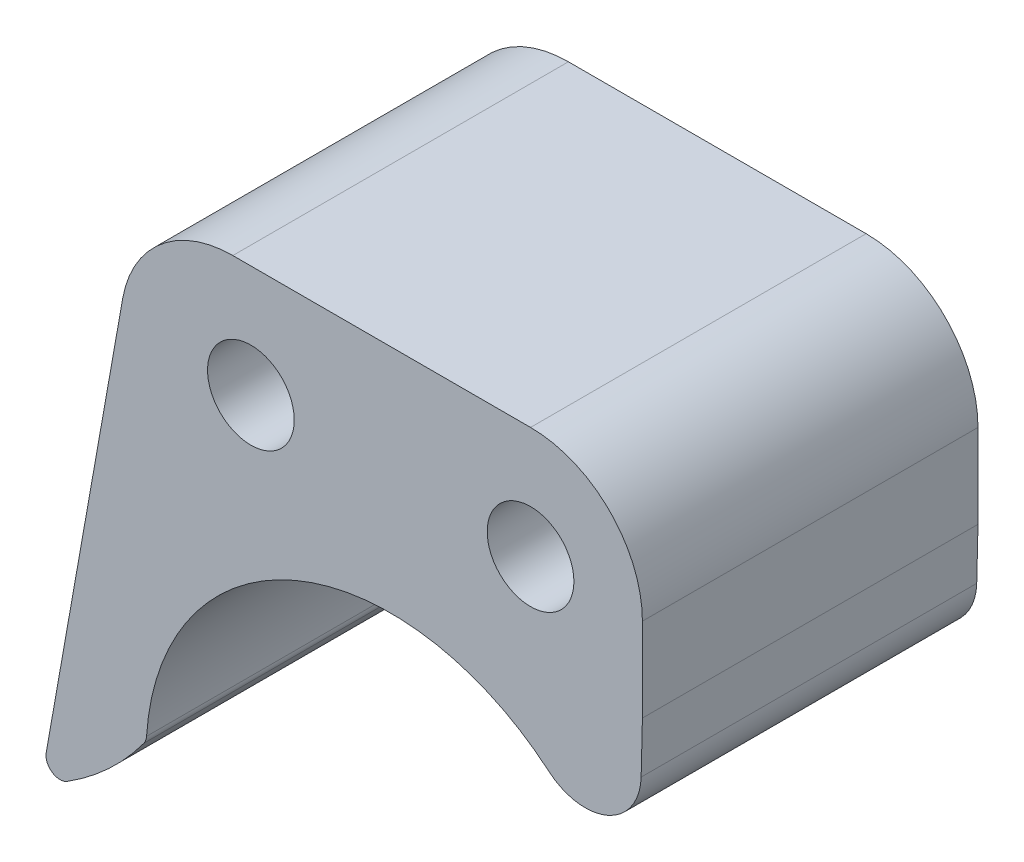
ISO-10303-21;
HEADER;
FILE_DESCRIPTION(('STEP AP214'),'2;1');
FILE_NAME('part.step','',(''),(''),'','','');
FILE_SCHEMA(('AUTOMOTIVE_DESIGN { 1 0 10303 214 1 1 1 1 }'));
ENDSEC;
DATA;
#1=APPLICATION_CONTEXT('core data for automotive mechanical design processes');
#2=APPLICATION_PROTOCOL_DEFINITION('international standard','automotive_design',2000,#1);
#3=PRODUCT_CONTEXT('',#1,'mechanical');
#4=PRODUCT('Part','Part','',(#3));
#5=PRODUCT_RELATED_PRODUCT_CATEGORY('part','',(#4));
#6=PRODUCT_DEFINITION_FORMATION('','',#4);
#7=PRODUCT_DEFINITION_CONTEXT('part definition',#1,'design');
#8=PRODUCT_DEFINITION('design','',#6,#7);
#9=PRODUCT_DEFINITION_SHAPE('','',#8);
#10=(LENGTH_UNIT() NAMED_UNIT(*) SI_UNIT(.MILLI.,.METRE.));
#11=(NAMED_UNIT(*) PLANE_ANGLE_UNIT() SI_UNIT($,.RADIAN.));
#12=(NAMED_UNIT(*) SI_UNIT($,.STERADIAN.) SOLID_ANGLE_UNIT());
#13=UNCERTAINTY_MEASURE_WITH_UNIT(LENGTH_MEASURE(1.E-05),#10,'distance_accuracy_value','');
#14=(GEOMETRIC_REPRESENTATION_CONTEXT(3) GLOBAL_UNCERTAINTY_ASSIGNED_CONTEXT((#13)) GLOBAL_UNIT_ASSIGNED_CONTEXT((#10,
#11,#12)) REPRESENTATION_CONTEXT('',''));
#15=CARTESIAN_POINT('',(0.,0.,0.));
#16=DIRECTION('',(0.,0.,1.));
#17=DIRECTION('',(1.,0.,0.));
#18=AXIS2_PLACEMENT_3D('',#15,#16,#17);
#19=CARTESIAN_POINT('',(0.,0.,12.));
#20=DIRECTION('',(0.,0.,1.));
#21=DIRECTION('',(1.,0.,0.));
#22=AXIS2_PLACEMENT_3D('',#19,#20,#21);
#23=PLANE('',#22);
#24=CARTESIAN_POINT('',(0.,0.,12.));
#25=DIRECTION('',(0.,0.,1.));
#26=DIRECTION('',(1.,0.,0.));
#27=AXIS2_PLACEMENT_3D('',#24,#25,#26);
#28=CIRCLE('',#27,1.55);
#29=CARTESIAN_POINT('',(1.55,0.,12.));
#30=VERTEX_POINT('',#29);
#31=EDGE_CURVE('E207',#30,#30,#28,.T.);
#32=ORIENTED_EDGE('',*,*,#31,.F.);
#33=EDGE_LOOP('',(#32));
#34=FACE_BOUND('',#33,.T.);
#35=CARTESIAN_POINT('',(4.99999999998341,-13.0000000000022,12.));
#36=DIRECTION('',(0.,0.,-1.));
#37=DIRECTION('',(1.,0.,0.));
#38=AXIS2_PLACEMENT_3D('',#35,#36,#37);
#39=CIRCLE('',#38,8.75);
#40=CARTESIAN_POINT('',(-3.73152195715241,-12.4316477218726,12.));
#41=VERTEX_POINT('',#40);
#42=CARTESIAN_POINT('',(10.660883346936,-6.32790139969702,12.));
#43=VERTEX_POINT('',#42);
#44=EDGE_CURVE('E122',#41,#43,#39,.T.);
#45=ORIENTED_EDGE('',*,*,#44,.T.);
#46=CARTESIAN_POINT('',(11.9547995405252,-4.80285029105583,12.));
#47=DIRECTION('',(0.,0.,1.));
#48=DIRECTION('',(1.,0.,0.));
#49=AXIS2_PLACEMENT_3D('',#46,#47,#48);
#50=CIRCLE('',#49,2.);
#51=CARTESIAN_POINT('',(13.9541881281477,-4.85230001991943,12.));
#52=VERTEX_POINT('',#51);
#53=EDGE_CURVE('E57',#43,#52,#50,.T.);
#54=ORIENTED_EDGE('',*,*,#53,.T.);
#55=DIRECTION('',(0.0247248644318036,0.999694293811278,0.));
#56=VECTOR('',#55,1.);
#57=CARTESIAN_POINT('',(14.,-3.,12.));
#58=LINE('',#57,#56);
#59=CARTESIAN_POINT('',(14.,-3.,12.));
#60=VERTEX_POINT('',#59);
#61=EDGE_CURVE('E115',#52,#60,#58,.T.);
#62=ORIENTED_EDGE('',*,*,#61,.T.);
#63=DIRECTION('',(0.,1.,0.));
#64=VECTOR('',#63,1.);
#65=CARTESIAN_POINT('',(14.,-3.,12.));
#66=LINE('',#65,#64);
#67=CARTESIAN_POINT('',(14.,0.,12.));
#68=VERTEX_POINT('',#67);
#69=EDGE_CURVE('E118',#60,#68,#66,.T.);
#70=ORIENTED_EDGE('',*,*,#69,.T.);
#71=CARTESIAN_POINT('',(10.,0.,12.));
#72=DIRECTION('',(0.,0.,1.));
#73=DIRECTION('',(1.,0.,0.));
#74=AXIS2_PLACEMENT_3D('',#71,#72,#73);
#75=CIRCLE('',#74,4.);
#76=CARTESIAN_POINT('',(10.,4.,12.));
#77=VERTEX_POINT('',#76);
#78=EDGE_CURVE('E173',#68,#77,#75,.T.);
#79=ORIENTED_EDGE('',*,*,#78,.T.);
#80=DIRECTION('',(-1.,0.,0.));
#81=VECTOR('',#80,1.);
#82=CARTESIAN_POINT('',(14.,4.,12.));
#83=LINE('',#82,#81);
#84=CARTESIAN_POINT('',(-0.646610090377423,4.,12.));
#85=VERTEX_POINT('',#84);
#86=EDGE_CURVE('E131',#77,#85,#83,.T.);
#87=ORIENTED_EDGE('',*,*,#86,.T.);
#88=CARTESIAN_POINT('',(-0.646610090377422,0.,12.));
#89=DIRECTION('',(0.,0.,1.));
#90=DIRECTION('',(1.,0.,0.));
#91=AXIS2_PLACEMENT_3D('',#88,#89,#90);
#92=CIRCLE('',#91,4.);
#93=CARTESIAN_POINT('',(-4.58522617799293,0.69807113847825,12.));
#94=VERTEX_POINT('',#93);
#95=EDGE_CURVE('E171',#85,#94,#92,.T.);
#96=ORIENTED_EDGE('',*,*,#95,.T.);
#97=DIRECTION('',(-0.174517784619562,-0.984654021903877,0.));
#98=VECTOR('',#97,1.);
#99=CARTESIAN_POINT('',(-4.,4.,12.));
#100=LINE('',#99,#98);
#101=CARTESIAN_POINT('',(-7.32009985962314,-14.7324729512637,12.));
#102=VERTEX_POINT('',#101);
#103=EDGE_CURVE('E192',#94,#102,#100,.T.);
#104=ORIENTED_EDGE('',*,*,#103,.T.);
#105=CARTESIAN_POINT('',(-6.8277728486712,-14.8197318435735,12.));
#106=DIRECTION('',(0.,0.,1.));
#107=DIRECTION('',(1.,0.,0.));
#108=AXIS2_PLACEMENT_3D('',#105,#106,#107);
#109=CIRCLE('',#108,0.5);
#110=CARTESIAN_POINT('',(-6.56123864332342,-15.2427679145883,12.));
#111=VERTEX_POINT('',#110);
#112=EDGE_CURVE('E147',#102,#111,#109,.T.);
#113=ORIENTED_EDGE('',*,*,#112,.T.);
#114=CARTESIAN_POINT('',(-11.891922750279,-6.78204649429253,12.));
#115=DIRECTION('',(0.,0.,1.));
#116=DIRECTION('',(1.,0.,0.));
#117=AXIS2_PLACEMENT_3D('',#114,#115,#116);
#118=CIRCLE('',#117,10.);
#119=CARTESIAN_POINT('',(-3.82723150681556,-12.6948085517073,12.));
#120=VERTEX_POINT('',#119);
#121=EDGE_CURVE('E190',#111,#120,#118,.T.);
#122=ORIENTED_EDGE('',*,*,#121,.T.);
#123=CARTESIAN_POINT('',(-4.23046606898874,-12.3991704488366,12.));
#124=DIRECTION('',(0.,0.,1.));
#125=DIRECTION('',(1.,0.,0.));
#126=AXIS2_PLACEMENT_3D('',#123,#124,#125);
#127=CIRCLE('',#126,0.5);
#128=EDGE_CURVE('E149',#120,#41,#127,.T.);
#129=ORIENTED_EDGE('',*,*,#128,.T.);
#130=EDGE_LOOP('',(#45,#54,#62,#70,#79,#87,#96,#104,#113,#122,#129));
#131=FACE_BOUND('',#130,.T.);
#132=CARTESIAN_POINT('',(10.,0.,12.));
#133=DIRECTION('',(0.,0.,1.));
#134=DIRECTION('',(1.,0.,0.));
#135=AXIS2_PLACEMENT_3D('',#132,#133,#134);
#136=CIRCLE('',#135,1.55);
#137=CARTESIAN_POINT('',(11.55,0.,12.));
#138=VERTEX_POINT('',#137);
#139=EDGE_CURVE('E201',#138,#138,#136,.T.);
#140=ORIENTED_EDGE('',*,*,#139,.F.);
#141=EDGE_LOOP('',(#140));
#142=FACE_BOUND('',#141,.T.);
#143=ADVANCED_FACE('F35',(#34,#131,#142),#23,.T.);
#144=CARTESIAN_POINT('',(0.,0.,0.));
#145=DIRECTION('',(0.,0.,1.));
#146=DIRECTION('',(1.,0.,0.));
#147=AXIS2_PLACEMENT_3D('',#144,#145,#146);
#148=PLANE('',#147);
#149=DIRECTION('',(-0.0247248644318036,-0.999694293811278,0.));
#150=VECTOR('',#149,1.);
#151=CARTESIAN_POINT('',(14.,-3.,0.));
#152=LINE('',#151,#150);
#153=CARTESIAN_POINT('',(14.,-3.,0.));
#154=VERTEX_POINT('',#153);
#155=CARTESIAN_POINT('',(13.9541881281477,-4.85230001991943,0.));
#156=VERTEX_POINT('',#155);
#157=EDGE_CURVE('E135',#154,#156,#152,.T.);
#158=ORIENTED_EDGE('',*,*,#157,.T.);
#159=CARTESIAN_POINT('',(11.9547995405252,-4.80285029105583,0.));
#160=DIRECTION('',(0.,0.,1.));
#161=DIRECTION('',(1.,0.,0.));
#162=AXIS2_PLACEMENT_3D('',#159,#160,#161);
#163=CIRCLE('',#162,2.);
#164=CARTESIAN_POINT('',(10.660883346936,-6.32790139969702,0.));
#165=VERTEX_POINT('',#164);
#166=EDGE_CURVE('E11',#156,#165,#163,.F.);
#167=ORIENTED_EDGE('',*,*,#166,.T.);
#168=CARTESIAN_POINT('',(4.99999999998341,-13.0000000000022,0.));
#169=DIRECTION('',(0.,0.,1.));
#170=DIRECTION('',(1.,0.,0.));
#171=AXIS2_PLACEMENT_3D('',#168,#169,#170);
#172=CIRCLE('',#171,8.75);
#173=CARTESIAN_POINT('',(-3.73152195715241,-12.4316477218726,0.));
#174=VERTEX_POINT('',#173);
#175=EDGE_CURVE('E121',#165,#174,#172,.T.);
#176=ORIENTED_EDGE('',*,*,#175,.T.);
#177=CARTESIAN_POINT('',(-4.23046606898874,-12.3991704488366,0.));
#178=DIRECTION('',(0.,0.,1.));
#179=DIRECTION('',(1.,0.,0.));
#180=AXIS2_PLACEMENT_3D('',#177,#178,#179);
#181=CIRCLE('',#180,0.5);
#182=CARTESIAN_POINT('',(-3.82723150681556,-12.6948085517073,0.));
#183=VERTEX_POINT('',#182);
#184=EDGE_CURVE('E156',#174,#183,#181,.F.);
#185=ORIENTED_EDGE('',*,*,#184,.T.);
#186=CARTESIAN_POINT('',(-11.891922750279,-6.78204649429253,0.));
#187=DIRECTION('',(0.,0.,1.));
#188=DIRECTION('',(1.,0.,0.));
#189=AXIS2_PLACEMENT_3D('',#186,#187,#188);
#190=CIRCLE('',#189,10.);
#191=CARTESIAN_POINT('',(-6.56123864332342,-15.2427679145883,0.));
#192=VERTEX_POINT('',#191);
#193=EDGE_CURVE('E196',#183,#192,#190,.F.);
#194=ORIENTED_EDGE('',*,*,#193,.T.);
#195=CARTESIAN_POINT('',(-6.8277728486712,-14.8197318435735,0.));
#196=DIRECTION('',(0.,0.,1.));
#197=DIRECTION('',(1.,0.,0.));
#198=AXIS2_PLACEMENT_3D('',#195,#196,#197);
#199=CIRCLE('',#198,0.5);
#200=CARTESIAN_POINT('',(-7.32009985962314,-14.7324729512637,0.));
#201=VERTEX_POINT('',#200);
#202=EDGE_CURVE('E154',#192,#201,#199,.F.);
#203=ORIENTED_EDGE('',*,*,#202,.T.);
#204=DIRECTION('',(0.174517784619562,0.984654021903877,0.));
#205=VECTOR('',#204,1.);
#206=CARTESIAN_POINT('',(-4.,4.,0.));
#207=LINE('',#206,#205);
#208=CARTESIAN_POINT('',(-4.58522617799293,0.698071138478249,0.));
#209=VERTEX_POINT('',#208);
#210=EDGE_CURVE('E200',#201,#209,#207,.T.);
#211=ORIENTED_EDGE('',*,*,#210,.T.);
#212=CARTESIAN_POINT('',(-0.646610090377422,0.,0.));
#213=DIRECTION('',(0.,0.,1.));
#214=DIRECTION('',(1.,0.,0.));
#215=AXIS2_PLACEMENT_3D('',#212,#213,#214);
#216=CIRCLE('',#215,4.);
#217=CARTESIAN_POINT('',(-0.646610090377423,4.,0.));
#218=VERTEX_POINT('',#217);
#219=EDGE_CURVE('E166',#209,#218,#216,.F.);
#220=ORIENTED_EDGE('',*,*,#219,.T.);
#221=DIRECTION('',(-1.,0.,0.));
#222=VECTOR('',#221,1.);
#223=CARTESIAN_POINT('',(14.,4.,0.));
#224=LINE('',#223,#222);
#225=CARTESIAN_POINT('',(10.,4.,0.));
#226=VERTEX_POINT('',#225);
#227=EDGE_CURVE('E132',#226,#218,#224,.T.);
#228=ORIENTED_EDGE('',*,*,#227,.F.);
#229=CARTESIAN_POINT('',(10.,0.,0.));
#230=DIRECTION('',(0.,0.,1.));
#231=DIRECTION('',(1.,0.,0.));
#232=AXIS2_PLACEMENT_3D('',#229,#230,#231);
#233=CIRCLE('',#232,4.);
#234=CARTESIAN_POINT('',(14.,0.,0.));
#235=VERTEX_POINT('',#234);
#236=EDGE_CURVE('E168',#226,#235,#233,.F.);
#237=ORIENTED_EDGE('',*,*,#236,.T.);
#238=DIRECTION('',(0.,1.,0.));
#239=VECTOR('',#238,1.);
#240=CARTESIAN_POINT('',(14.,-3.,0.));
#241=LINE('',#240,#239);
#242=EDGE_CURVE('E210',#154,#235,#241,.T.);
#243=ORIENTED_EDGE('',*,*,#242,.F.);
#244=EDGE_LOOP('',(#158,#167,#176,#185,#194,#203,#211,#220,#228,#237,#243));
#245=FACE_BOUND('',#244,.T.);
#246=CARTESIAN_POINT('',(0.,0.,0.));
#247=DIRECTION('',(0.,0.,1.));
#248=DIRECTION('',(1.,0.,0.));
#249=AXIS2_PLACEMENT_3D('',#246,#247,#248);
#250=CIRCLE('',#249,1.55);
#251=CARTESIAN_POINT('',(1.55,0.,0.));
#252=VERTEX_POINT('',#251);
#253=EDGE_CURVE('E204',#252,#252,#250,.T.);
#254=ORIENTED_EDGE('',*,*,#253,.T.);
#255=EDGE_LOOP('',(#254));
#256=FACE_BOUND('',#255,.T.);
#257=CARTESIAN_POINT('',(10.,0.,0.));
#258=DIRECTION('',(0.,0.,1.));
#259=DIRECTION('',(1.,0.,0.));
#260=AXIS2_PLACEMENT_3D('',#257,#258,#259);
#261=CIRCLE('',#260,1.55);
#262=CARTESIAN_POINT('',(11.55,0.,0.));
#263=VERTEX_POINT('',#262);
#264=EDGE_CURVE('E199',#263,#263,#261,.T.);
#265=ORIENTED_EDGE('',*,*,#264,.T.);
#266=EDGE_LOOP('',(#265));
#267=FACE_BOUND('',#266,.T.);
#268=ADVANCED_FACE('F234',(#245,#256,#267),#148,.F.);
#269=CARTESIAN_POINT('',(14.,-3.,12.));
#270=DIRECTION('',(-1.,0.,0.));
#271=DIRECTION('',(0.,0.,1.));
#272=AXIS2_PLACEMENT_3D('',#269,#270,#271);
#273=PLANE('',#272);
#274=ORIENTED_EDGE('',*,*,#242,.T.);
#275=DIRECTION('',(0.,0.,-1.));
#276=VECTOR('',#275,1.);
#277=CARTESIAN_POINT('',(14.,0.,12.));
#278=LINE('',#277,#276);
#279=EDGE_CURVE('E130',#235,#68,#278,.F.);
#280=ORIENTED_EDGE('',*,*,#279,.T.);
#281=ORIENTED_EDGE('',*,*,#69,.F.);
#282=DIRECTION('',(0.,0.,-1.));
#283=VECTOR('',#282,1.);
#284=CARTESIAN_POINT('',(14.,-3.,12.));
#285=LINE('',#284,#283);
#286=EDGE_CURVE('E127',#60,#154,#285,.T.);
#287=ORIENTED_EDGE('',*,*,#286,.T.);
#288=EDGE_LOOP('',(#274,#280,#281,#287));
#289=FACE_BOUND('',#288,.T.);
#290=ADVANCED_FACE('F126',(#289),#273,.F.);
#291=CARTESIAN_POINT('',(14.,4.,12.));
#292=DIRECTION('',(0.,-1.,0.));
#293=DIRECTION('',(1.,0.,0.));
#294=AXIS2_PLACEMENT_3D('',#291,#292,#293);
#295=PLANE('',#294);
#296=ORIENTED_EDGE('',*,*,#86,.F.);
#297=DIRECTION('',(0.,0.,-1.));
#298=VECTOR('',#297,1.);
#299=CARTESIAN_POINT('',(10.,4.,12.));
#300=LINE('',#299,#298);
#301=EDGE_CURVE('E163',#77,#226,#300,.T.);
#302=ORIENTED_EDGE('',*,*,#301,.T.);
#303=ORIENTED_EDGE('',*,*,#227,.T.);
#304=DIRECTION('',(0.,0.,-1.));
#305=VECTOR('',#304,1.);
#306=CARTESIAN_POINT('',(-0.646610090377423,4.,12.));
#307=LINE('',#306,#305);
#308=EDGE_CURVE('E161',#218,#85,#307,.F.);
#309=ORIENTED_EDGE('',*,*,#308,.T.);
#310=EDGE_LOOP('',(#296,#302,#303,#309));
#311=FACE_BOUND('',#310,.T.);
#312=ADVANCED_FACE('F217',(#311),#295,.F.);
#313=CARTESIAN_POINT('',(0.,0.,12.));
#314=DIRECTION('',(0.,0.,-1.));
#315=DIRECTION('',(-1.,0.,0.));
#316=AXIS2_PLACEMENT_3D('',#313,#314,#315);
#317=CYLINDRICAL_SURFACE('',#316,1.55);
#318=ORIENTED_EDGE('',*,*,#31,.T.);
#319=EDGE_LOOP('',(#318));
#320=FACE_BOUND('',#319,.T.);
#321=ORIENTED_EDGE('',*,*,#253,.F.);
#322=EDGE_LOOP('',(#321));
#323=FACE_BOUND('',#322,.T.);
#324=ADVANCED_FACE('F267',(#320,#323),#317,.F.);
#325=CARTESIAN_POINT('',(10.,0.,12.));
#326=DIRECTION('',(0.,0.,-1.));
#327=DIRECTION('',(-1.,0.,0.));
#328=AXIS2_PLACEMENT_3D('',#325,#326,#327);
#329=CYLINDRICAL_SURFACE('',#328,1.55);
#330=ORIENTED_EDGE('',*,*,#139,.T.);
#331=EDGE_LOOP('',(#330));
#332=FACE_BOUND('',#331,.T.);
#333=ORIENTED_EDGE('',*,*,#264,.F.);
#334=EDGE_LOOP('',(#333));
#335=FACE_BOUND('',#334,.T.);
#336=ADVANCED_FACE('F288',(#332,#335),#329,.F.);
#337=CARTESIAN_POINT('',(-4.,4.,-29.2090288510913));
#338=DIRECTION('',(-0.984654021903877,0.174517784619562,0.));
#339=DIRECTION('',(-0.174517784619562,-0.984654021903877,0.));
#340=AXIS2_PLACEMENT_3D('',#337,#338,#339);
#341=PLANE('',#340);
#342=ORIENTED_EDGE('',*,*,#103,.F.);
#343=DIRECTION('',(0.,0.,-1.));
#344=VECTOR('',#343,1.);
#345=CARTESIAN_POINT('',(-4.58522617799293,0.69807113847825,0.));
#346=LINE('',#345,#344);
#347=EDGE_CURVE('E175',#94,#209,#346,.T.);
#348=ORIENTED_EDGE('',*,*,#347,.T.);
#349=ORIENTED_EDGE('',*,*,#210,.F.);
#350=DIRECTION('',(0.,0.,1.));
#351=VECTOR('',#350,1.);
#352=CARTESIAN_POINT('',(-7.32009985962314,-14.7324729512637,-29.2090288510913));
#353=LINE('',#352,#351);
#354=EDGE_CURVE('E158',#201,#102,#353,.T.);
#355=ORIENTED_EDGE('',*,*,#354,.T.);
#356=EDGE_LOOP('',(#342,#348,#349,#355));
#357=FACE_BOUND('',#356,.T.);
#358=ADVANCED_FACE('F227',(#357),#341,.T.);
#359=CARTESIAN_POINT('',(14.,-3.,-29.2090288510913));
#360=DIRECTION('',(0.999694293811278,-0.0247248644318036,0.));
#361=DIRECTION('',(0.0247248644318036,0.999694293811278,0.));
#362=AXIS2_PLACEMENT_3D('',#359,#360,#361);
#363=PLANE('',#362);
#364=ORIENTED_EDGE('',*,*,#61,.F.);
#365=DIRECTION('',(0.,0.,1.));
#366=VECTOR('',#365,1.);
#367=CARTESIAN_POINT('',(13.9541881281477,-4.85230001991943,-29.2090288510913));
#368=LINE('',#367,#366);
#369=EDGE_CURVE('E43',#52,#156,#368,.F.);
#370=ORIENTED_EDGE('',*,*,#369,.T.);
#371=ORIENTED_EDGE('',*,*,#157,.F.);
#372=ORIENTED_EDGE('',*,*,#286,.F.);
#373=EDGE_LOOP('',(#364,#370,#371,#372));
#374=FACE_BOUND('',#373,.T.);
#375=ADVANCED_FACE('F134',(#374),#363,.T.);
#376=CARTESIAN_POINT('',(4.99999999998341,-13.0000000000022,-29.2090288510913));
#377=DIRECTION('',(0.,0.,1.));
#378=DIRECTION('',(1.,0.,0.));
#379=AXIS2_PLACEMENT_3D('',#376,#377,#378);
#380=CYLINDRICAL_SURFACE('',#379,8.75);
#381=ORIENTED_EDGE('',*,*,#175,.F.);
#382=DIRECTION('',(0.,0.,1.));
#383=VECTOR('',#382,1.);
#384=CARTESIAN_POINT('',(10.660883346936,-6.32790139969702,-29.2090288510913));
#385=LINE('',#384,#383);
#386=EDGE_CURVE('E178',#165,#43,#385,.T.);
#387=ORIENTED_EDGE('',*,*,#386,.T.);
#388=ORIENTED_EDGE('',*,*,#44,.F.);
#389=DIRECTION('',(0.,0.,1.));
#390=VECTOR('',#389,1.);
#391=CARTESIAN_POINT('',(-3.7315219571524,-12.4316477218726,-29.2090288510913));
#392=LINE('',#391,#390);
#393=EDGE_CURVE('E151',#41,#174,#392,.F.);
#394=ORIENTED_EDGE('',*,*,#393,.T.);
#395=EDGE_LOOP('',(#381,#387,#388,#394));
#396=FACE_BOUND('',#395,.T.);
#397=ADVANCED_FACE('F185',(#396),#380,.F.);
#398=CARTESIAN_POINT('',(-11.891922750279,-6.78204649429253,-29.2090288510913));
#399=DIRECTION('',(0.,0.,1.));
#400=DIRECTION('',(1.,0.,0.));
#401=AXIS2_PLACEMENT_3D('',#398,#399,#400);
#402=CYLINDRICAL_SURFACE('',#401,10.);
#403=ORIENTED_EDGE('',*,*,#193,.F.);
#404=DIRECTION('',(0.,0.,1.));
#405=VECTOR('',#404,1.);
#406=CARTESIAN_POINT('',(-3.82723150681556,-12.6948085517073,-29.2090288510913));
#407=LINE('',#406,#405);
#408=EDGE_CURVE('E138',#183,#120,#407,.T.);
#409=ORIENTED_EDGE('',*,*,#408,.T.);
#410=ORIENTED_EDGE('',*,*,#121,.F.);
#411=DIRECTION('',(0.,0.,1.));
#412=VECTOR('',#411,1.);
#413=CARTESIAN_POINT('',(-6.56123864332342,-15.2427679145883,-29.2090288510913));
#414=LINE('',#413,#412);
#415=EDGE_CURVE('E136',#111,#192,#414,.F.);
#416=ORIENTED_EDGE('',*,*,#415,.T.);
#417=EDGE_LOOP('',(#403,#409,#410,#416));
#418=FACE_BOUND('',#417,.T.);
#419=ADVANCED_FACE('F243',(#418),#402,.T.);
#420=CARTESIAN_POINT('',(-4.23046606898874,-12.3991704488366,-29.2090288510913));
#421=DIRECTION('',(0.,0.,-1.));
#422=DIRECTION('',(-1.,0.,0.));
#423=AXIS2_PLACEMENT_3D('',#420,#421,#422);
#424=CYLINDRICAL_SURFACE('',#423,0.5);
#425=ORIENTED_EDGE('',*,*,#184,.F.);
#426=ORIENTED_EDGE('',*,*,#393,.F.);
#427=ORIENTED_EDGE('',*,*,#128,.F.);
#428=ORIENTED_EDGE('',*,*,#408,.F.);
#429=EDGE_LOOP('',(#425,#426,#427,#428));
#430=FACE_BOUND('',#429,.T.);
#431=ADVANCED_FACE('F240',(#430),#424,.T.);
#432=CARTESIAN_POINT('',(-6.8277728486712,-14.8197318435735,-29.2090288510913));
#433=DIRECTION('',(0.,0.,1.));
#434=DIRECTION('',(1.,0.,0.));
#435=AXIS2_PLACEMENT_3D('',#432,#433,#434);
#436=CYLINDRICAL_SURFACE('',#435,0.5);
#437=ORIENTED_EDGE('',*,*,#202,.F.);
#438=ORIENTED_EDGE('',*,*,#415,.F.);
#439=ORIENTED_EDGE('',*,*,#112,.F.);
#440=ORIENTED_EDGE('',*,*,#354,.F.);
#441=EDGE_LOOP('',(#437,#438,#439,#440));
#442=FACE_BOUND('',#441,.T.);
#443=ADVANCED_FACE('F247',(#442),#436,.T.);
#444=CARTESIAN_POINT('',(10.,0.,12.));
#445=DIRECTION('',(0.,0.,-1.));
#446=DIRECTION('',(-1.,0.,0.));
#447=AXIS2_PLACEMENT_3D('',#444,#445,#446);
#448=CYLINDRICAL_SURFACE('',#447,4.);
#449=ORIENTED_EDGE('',*,*,#78,.F.);
#450=ORIENTED_EDGE('',*,*,#279,.F.);
#451=ORIENTED_EDGE('',*,*,#236,.F.);
#452=ORIENTED_EDGE('',*,*,#301,.F.);
#453=EDGE_LOOP('',(#449,#450,#451,#452));
#454=FACE_BOUND('',#453,.T.);
#455=ADVANCED_FACE('F249',(#454),#448,.T.);
#456=CARTESIAN_POINT('',(-0.646610090377422,0.,-29.2090288510913));
#457=DIRECTION('',(0.,0.,1.));
#458=DIRECTION('',(1.,0.,0.));
#459=AXIS2_PLACEMENT_3D('',#456,#457,#458);
#460=CYLINDRICAL_SURFACE('',#459,4.);
#461=ORIENTED_EDGE('',*,*,#95,.F.);
#462=ORIENTED_EDGE('',*,*,#308,.F.);
#463=ORIENTED_EDGE('',*,*,#219,.F.);
#464=ORIENTED_EDGE('',*,*,#347,.F.);
#465=EDGE_LOOP('',(#461,#462,#463,#464));
#466=FACE_BOUND('',#465,.T.);
#467=ADVANCED_FACE('F222',(#466),#460,.T.);
#468=CARTESIAN_POINT('',(11.9547995405252,-4.80285029105583,-29.2090288510913));
#469=DIRECTION('',(0.,0.,1.));
#470=DIRECTION('',(1.,0.,0.));
#471=AXIS2_PLACEMENT_3D('',#468,#469,#470);
#472=CYLINDRICAL_SURFACE('',#471,2.);
#473=ORIENTED_EDGE('',*,*,#166,.F.);
#474=ORIENTED_EDGE('',*,*,#369,.F.);
#475=ORIENTED_EDGE('',*,*,#53,.F.);
#476=ORIENTED_EDGE('',*,*,#386,.F.);
#477=EDGE_LOOP('',(#473,#474,#475,#476));
#478=FACE_BOUND('',#477,.T.);
#479=ADVANCED_FACE('F37',(#478),#472,.T.);
#480=CLOSED_SHELL('',(#143,#268,#290,#312,#324,#336,#358,#375,#397,#419,#431,#443,#455,#467,#479));
#481=MANIFOLD_SOLID_BREP('B2',#480);
#482=ADVANCED_BREP_SHAPE_REPRESENTATION('',(#18,#481),#14);
#483=SHAPE_DEFINITION_REPRESENTATION(#9,#482);
ENDSEC;
END-ISO-10303-21;
